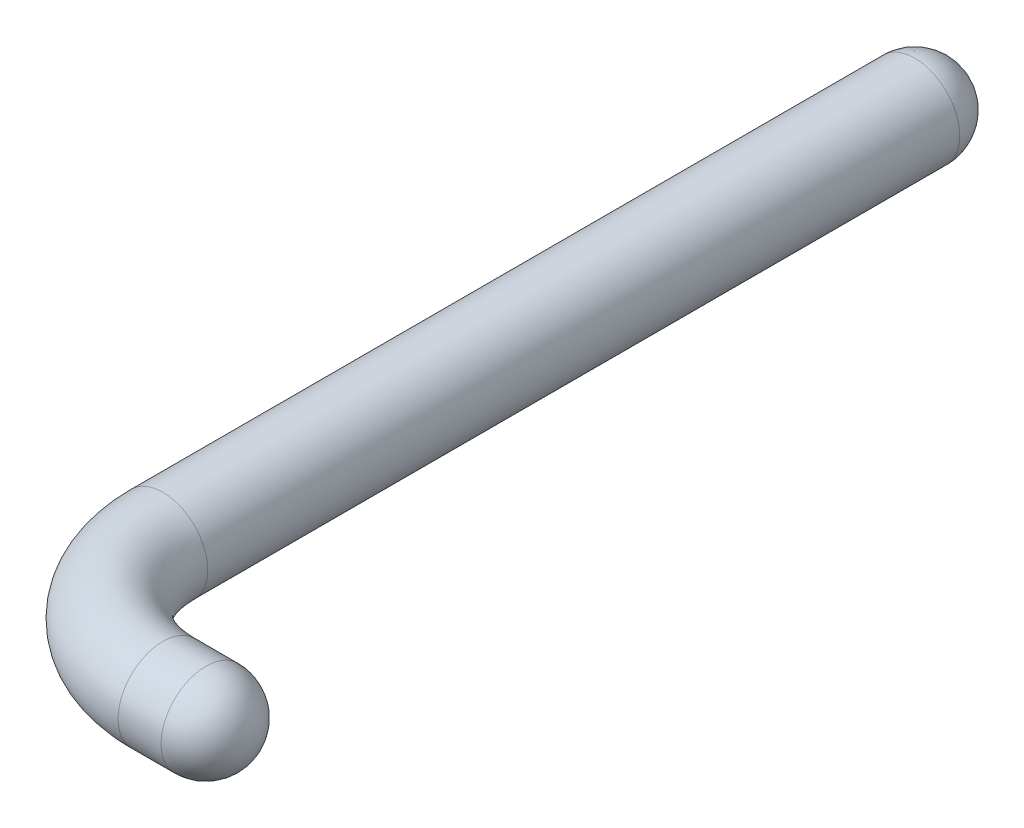
ISO-10303-21;
HEADER;
FILE_DESCRIPTION(('STEP AP214'),'2;1');
FILE_NAME('part.step','',(''),(''),'','','');
FILE_SCHEMA(('AUTOMOTIVE_DESIGN { 1 0 10303 214 1 1 1 1 }'));
ENDSEC;
DATA;
#1=APPLICATION_CONTEXT('core data for automotive mechanical design processes');
#2=APPLICATION_PROTOCOL_DEFINITION('international standard','automotive_design',2000,#1);
#3=PRODUCT_CONTEXT('',#1,'mechanical');
#4=PRODUCT('Part','Part','',(#3));
#5=PRODUCT_RELATED_PRODUCT_CATEGORY('part','',(#4));
#6=PRODUCT_DEFINITION_FORMATION('','',#4);
#7=PRODUCT_DEFINITION_CONTEXT('part definition',#1,'design');
#8=PRODUCT_DEFINITION('design','',#6,#7);
#9=PRODUCT_DEFINITION_SHAPE('','',#8);
#10=(LENGTH_UNIT() NAMED_UNIT(*) SI_UNIT(.MILLI.,.METRE.));
#11=(NAMED_UNIT(*) PLANE_ANGLE_UNIT() SI_UNIT($,.RADIAN.));
#12=(NAMED_UNIT(*) SI_UNIT($,.STERADIAN.) SOLID_ANGLE_UNIT());
#13=UNCERTAINTY_MEASURE_WITH_UNIT(LENGTH_MEASURE(1.E-05),#10,'distance_accuracy_value','');
#14=(GEOMETRIC_REPRESENTATION_CONTEXT(3) GLOBAL_UNCERTAINTY_ASSIGNED_CONTEXT((#13)) GLOBAL_UNIT_ASSIGNED_CONTEXT((#10,
#11,#12)) REPRESENTATION_CONTEXT('',''));
#15=CARTESIAN_POINT('',(0.,0.,0.));
#16=DIRECTION('',(0.,0.,1.));
#17=DIRECTION('',(1.,0.,0.));
#18=AXIS2_PLACEMENT_3D('',#15,#16,#17);
#19=CARTESIAN_POINT('',(13.97,0.,3.5));
#20=DIRECTION('',(0.,0.,1.));
#21=DIRECTION('',(0.,1.,0.));
#22=AXIS2_PLACEMENT_3D('',#19,#20,#21);
#23=SPHERICAL_SURFACE('',#22,0.331);
#24=CARTESIAN_POINT('',(13.97,0.,3.5));
#25=DIRECTION('',(1.,0.,0.));
#26=DIRECTION('',(0.,0.,-1.));
#27=AXIS2_PLACEMENT_3D('',#24,#25,#26);
#28=CIRCLE('',#27,0.331);
#29=CARTESIAN_POINT('',(13.97,0.,3.169));
#30=VERTEX_POINT('',#29);
#31=CARTESIAN_POINT('',(13.97,0.,3.831));
#32=VERTEX_POINT('',#31);
#33=EDGE_CURVE('E43',#30,#32,#28,.F.);
#34=ORIENTED_EDGE('',*,*,#33,.F.);
#35=CARTESIAN_POINT('',(13.97,0.,3.5));
#36=DIRECTION('',(1.,0.,0.));
#37=DIRECTION('',(0.,0.,-1.));
#38=AXIS2_PLACEMENT_3D('',#35,#36,#37);
#39=CIRCLE('',#38,0.331);
#40=EDGE_CURVE('E41',#32,#30,#39,.F.);
#41=ORIENTED_EDGE('',*,*,#40,.F.);
#42=EDGE_LOOP('',(#34,#41));
#43=FACE_BOUND('',#42,.T.);
#44=ADVANCED_FACE('F17',(#43),#23,.T.);
#45=CARTESIAN_POINT('',(13.6525,0.,3.5));
#46=DIRECTION('',(1.,0.,0.));
#47=DIRECTION('',(0.,0.,-1.));
#48=AXIS2_PLACEMENT_3D('',#45,#46,#47);
#49=CYLINDRICAL_SURFACE('',#48,0.331);
#50=CARTESIAN_POINT('',(13.6525,0.,3.5));
#51=DIRECTION('',(1.,0.,0.));
#52=DIRECTION('',(0.,0.,1.));
#53=AXIS2_PLACEMENT_3D('',#50,#51,#52);
#54=CIRCLE('',#53,0.331);
#55=CARTESIAN_POINT('',(13.6525,0.,3.831));
#56=VERTEX_POINT('',#55);
#57=EDGE_CURVE('E46',#56,#56,#54,.F.);
#58=ORIENTED_EDGE('',*,*,#57,.F.);
#59=EDGE_LOOP('',(#58));
#60=FACE_BOUND('',#59,.T.);
#61=ORIENTED_EDGE('',*,*,#40,.T.);
#62=ORIENTED_EDGE('',*,*,#33,.T.);
#63=EDGE_LOOP('',(#61,#62));
#64=FACE_BOUND('',#63,.T.);
#65=ADVANCED_FACE('F45',(#60,#64),#49,.T.);
#66=CARTESIAN_POINT('',(13.6525,0.,2.5475));
#67=DIRECTION('',(0.,1.,0.));
#68=DIRECTION('',(0.,0.,1.));
#69=AXIS2_PLACEMENT_3D('',#66,#67,#68);
#70=TOROIDAL_SURFACE('',#69,0.9525,0.331);
#71=CARTESIAN_POINT('',(12.7,0.,2.5475));
#72=DIRECTION('',(0.,0.,1.));
#73=DIRECTION('',(1.,0.,0.));
#74=AXIS2_PLACEMENT_3D('',#71,#72,#73);
#75=CIRCLE('',#74,0.331);
#76=CARTESIAN_POINT('',(13.031,0.,2.5475));
#77=VERTEX_POINT('',#76);
#78=EDGE_CURVE('E26',#77,#77,#75,.F.);
#79=ORIENTED_EDGE('',*,*,#78,.F.);
#80=EDGE_LOOP('',(#79));
#81=FACE_BOUND('',#80,.T.);
#82=ORIENTED_EDGE('',*,*,#57,.T.);
#83=EDGE_LOOP('',(#82));
#84=FACE_BOUND('',#83,.T.);
#85=ADVANCED_FACE('F56',(#81,#84),#70,.T.);
#86=CARTESIAN_POINT('',(12.7,0.,-3.));
#87=DIRECTION('',(1.,0.,0.));
#88=DIRECTION('',(0.,1.,0.));
#89=AXIS2_PLACEMENT_3D('',#86,#87,#88);
#90=SPHERICAL_SURFACE('',#89,0.331);
#91=CARTESIAN_POINT('',(12.7,0.,-3.));
#92=DIRECTION('',(0.,0.,1.));
#93=DIRECTION('',(1.,0.,0.));
#94=AXIS2_PLACEMENT_3D('',#91,#92,#93);
#95=CIRCLE('',#94,0.331);
#96=CARTESIAN_POINT('',(12.369,0.,-3.));
#97=VERTEX_POINT('',#96);
#98=CARTESIAN_POINT('',(13.031,0.,-3.));
#99=VERTEX_POINT('',#98);
#100=EDGE_CURVE('E34',#97,#99,#95,.T.);
#101=ORIENTED_EDGE('',*,*,#100,.F.);
#102=CARTESIAN_POINT('',(12.7,0.,-3.));
#103=DIRECTION('',(0.,0.,1.));
#104=DIRECTION('',(1.,0.,0.));
#105=AXIS2_PLACEMENT_3D('',#102,#103,#104);
#106=CIRCLE('',#105,0.331);
#107=EDGE_CURVE('E11',#99,#97,#106,.T.);
#108=ORIENTED_EDGE('',*,*,#107,.F.);
#109=EDGE_LOOP('',(#101,#108));
#110=FACE_BOUND('',#109,.T.);
#111=ADVANCED_FACE('F59',(#110),#90,.T.);
#112=CARTESIAN_POINT('',(12.7,0.,-3.));
#113=DIRECTION('',(0.,0.,1.));
#114=DIRECTION('',(1.,0.,0.));
#115=AXIS2_PLACEMENT_3D('',#112,#113,#114);
#116=CYLINDRICAL_SURFACE('',#115,0.331);
#117=ORIENTED_EDGE('',*,*,#100,.T.);
#118=ORIENTED_EDGE('',*,*,#107,.T.);
#119=EDGE_LOOP('',(#117,#118));
#120=FACE_BOUND('',#119,.T.);
#121=ORIENTED_EDGE('',*,*,#78,.T.);
#122=EDGE_LOOP('',(#121));
#123=FACE_BOUND('',#122,.T.);
#124=ADVANCED_FACE('F69',(#120,#123),#116,.T.);
#125=CLOSED_SHELL('',(#44,#65,#85,#111,#124));
#126=MANIFOLD_SOLID_BREP('B1',#125);
#127=ADVANCED_BREP_SHAPE_REPRESENTATION('',(#18,#126),#14);
#128=SHAPE_DEFINITION_REPRESENTATION(#9,#127);
ENDSEC;
END-ISO-10303-21;
